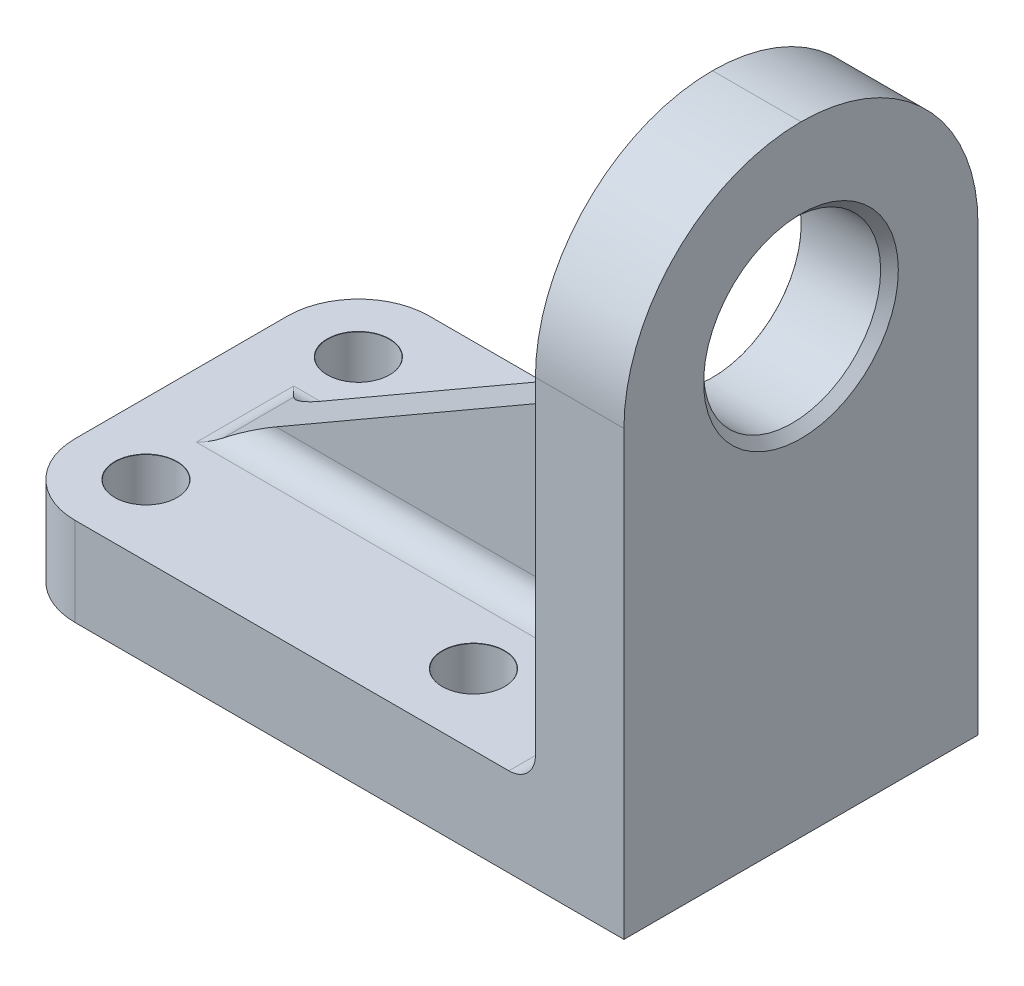
ISO-10303-21;
HEADER;
FILE_DESCRIPTION(('STEP AP214'),'2;1');
FILE_NAME('part.step','',(''),(''),'','','');
FILE_SCHEMA(('AUTOMOTIVE_DESIGN { 1 0 10303 214 1 1 1 1 }'));
ENDSEC;
DATA;
#1=APPLICATION_CONTEXT('core data for automotive mechanical design processes');
#2=APPLICATION_PROTOCOL_DEFINITION('international standard','automotive_design',2000,#1);
#3=PRODUCT_CONTEXT('',#1,'mechanical');
#4=PRODUCT('Part','Part','',(#3));
#5=PRODUCT_RELATED_PRODUCT_CATEGORY('part','',(#4));
#6=PRODUCT_DEFINITION_FORMATION('','',#4);
#7=PRODUCT_DEFINITION_CONTEXT('part definition',#1,'design');
#8=PRODUCT_DEFINITION('design','',#6,#7);
#9=PRODUCT_DEFINITION_SHAPE('','',#8);
#10=(LENGTH_UNIT() NAMED_UNIT(*) SI_UNIT(.MILLI.,.METRE.));
#11=(NAMED_UNIT(*) PLANE_ANGLE_UNIT() SI_UNIT($,.RADIAN.));
#12=(NAMED_UNIT(*) SI_UNIT($,.STERADIAN.) SOLID_ANGLE_UNIT());
#13=UNCERTAINTY_MEASURE_WITH_UNIT(LENGTH_MEASURE(1.E-05),#10,'distance_accuracy_value','');
#14=(GEOMETRIC_REPRESENTATION_CONTEXT(3) GLOBAL_UNCERTAINTY_ASSIGNED_CONTEXT((#13)) GLOBAL_UNIT_ASSIGNED_CONTEXT((#10,
#11,#12)) REPRESENTATION_CONTEXT('',''));
#15=CARTESIAN_POINT('',(0.,0.,0.));
#16=DIRECTION('',(0.,0.,1.));
#17=DIRECTION('',(1.,0.,0.));
#18=AXIS2_PLACEMENT_3D('',#15,#16,#17);
#19=CARTESIAN_POINT('',(0.,0.,-19.9999999999999));
#20=DIRECTION('',(0.,-1.,0.));
#21=DIRECTION('',(0.,0.,-1.));
#22=AXIS2_PLACEMENT_3D('',#19,#20,#21);
#23=PLANE('',#22);
#24=CARTESIAN_POINT('',(8.,0.,-11.9999999999999));
#25=DIRECTION('',(0.,1.,0.));
#26=DIRECTION('',(0.,0.,1.));
#27=AXIS2_PLACEMENT_3D('',#24,#25,#26);
#28=CIRCLE('',#27,3.5);
#29=CARTESIAN_POINT('',(8.,0.,-8.49999999999988));
#30=VERTEX_POINT('',#29);
#31=EDGE_CURVE('E554',#30,#30,#28,.T.);
#32=ORIENTED_EDGE('',*,*,#31,.T.);
#33=EDGE_LOOP('',(#32));
#34=FACE_BOUND('',#33,.T.);
#35=CARTESIAN_POINT('',(8.,0.,11.9999999999999));
#36=DIRECTION('',(0.,1.,0.));
#37=DIRECTION('',(0.,0.,1.));
#38=AXIS2_PLACEMENT_3D('',#35,#36,#37);
#39=CIRCLE('',#38,3.5);
#40=CARTESIAN_POINT('',(8.,0.,15.4999999999999));
#41=VERTEX_POINT('',#40);
#42=EDGE_CURVE('E565',#41,#41,#39,.T.);
#43=ORIENTED_EDGE('',*,*,#42,.T.);
#44=EDGE_LOOP('',(#43));
#45=FACE_BOUND('',#44,.T.);
#46=CARTESIAN_POINT('',(45.,0.,-11.9999999999999));
#47=DIRECTION('',(0.,1.,0.));
#48=DIRECTION('',(0.,0.,1.));
#49=AXIS2_PLACEMENT_3D('',#46,#47,#48);
#50=CIRCLE('',#49,3.5);
#51=CARTESIAN_POINT('',(45.,0.,-8.49999999999988));
#52=VERTEX_POINT('',#51);
#53=EDGE_CURVE('E577',#52,#52,#50,.T.);
#54=ORIENTED_EDGE('',*,*,#53,.T.);
#55=EDGE_LOOP('',(#54));
#56=FACE_BOUND('',#55,.T.);
#57=CARTESIAN_POINT('',(8.,0.,11.9999999999999));
#58=DIRECTION('',(0.,-1.,0.));
#59=DIRECTION('',(0.,0.,-1.));
#60=AXIS2_PLACEMENT_3D('',#57,#58,#59);
#61=CIRCLE('',#60,8.);
#62=CARTESIAN_POINT('',(8.,0.,19.9999999999999));
#63=VERTEX_POINT('',#62);
#64=CARTESIAN_POINT('',(0.,0.,11.9999999999999));
#65=VERTEX_POINT('',#64);
#66=EDGE_CURVE('E256',#63,#65,#61,.T.);
#67=ORIENTED_EDGE('',*,*,#66,.T.);
#68=DIRECTION('',(0.,0.,1.));
#69=VECTOR('',#68,1.);
#70=CARTESIAN_POINT('',(0.,0.,-19.9999999999999));
#71=LINE('',#70,#69);
#72=CARTESIAN_POINT('',(0.,0.,-11.9999999999999));
#73=VERTEX_POINT('',#72);
#74=EDGE_CURVE('E225',#73,#65,#71,.T.);
#75=ORIENTED_EDGE('',*,*,#74,.F.);
#76=CARTESIAN_POINT('',(8.,0.,-11.9999999999999));
#77=DIRECTION('',(0.,-1.,0.));
#78=DIRECTION('',(0.,0.,-1.));
#79=AXIS2_PLACEMENT_3D('',#76,#77,#78);
#80=CIRCLE('',#79,8.);
#81=CARTESIAN_POINT('',(8.,0.,-19.9999999999999));
#82=VERTEX_POINT('',#81);
#83=EDGE_CURVE('E253',#73,#82,#80,.T.);
#84=ORIENTED_EDGE('',*,*,#83,.T.);
#85=DIRECTION('',(1.,0.,0.));
#86=VECTOR('',#85,1.);
#87=CARTESIAN_POINT('',(0.,0.,-19.9999999999999));
#88=LINE('',#87,#86);
#89=CARTESIAN_POINT('',(70.,0.,-19.9999999999999));
#90=VERTEX_POINT('',#89);
#91=EDGE_CURVE('E210',#82,#90,#88,.T.);
#92=ORIENTED_EDGE('',*,*,#91,.T.);
#93=DIRECTION('',(0.,0.,1.));
#94=VECTOR('',#93,1.);
#95=CARTESIAN_POINT('',(70.,0.,-19.9999999999999));
#96=LINE('',#95,#94);
#97=CARTESIAN_POINT('',(70.,0.,19.9999999999999));
#98=VERTEX_POINT('',#97);
#99=EDGE_CURVE('E245',#90,#98,#96,.T.);
#100=ORIENTED_EDGE('',*,*,#99,.T.);
#101=DIRECTION('',(1.,0.,0.));
#102=VECTOR('',#101,1.);
#103=CARTESIAN_POINT('',(0.,0.,19.9999999999999));
#104=LINE('',#103,#102);
#105=EDGE_CURVE('E226',#63,#98,#104,.T.);
#106=ORIENTED_EDGE('',*,*,#105,.F.);
#107=EDGE_LOOP('',(#67,#75,#84,#92,#100,#106));
#108=FACE_BOUND('',#107,.T.);
#109=CARTESIAN_POINT('',(45.,0.,11.9999999999999));
#110=DIRECTION('',(0.,1.,0.));
#111=DIRECTION('',(0.,0.,1.));
#112=AXIS2_PLACEMENT_3D('',#109,#110,#111);
#113=CIRCLE('',#112,3.5);
#114=CARTESIAN_POINT('',(45.,0.,15.4999999999999));
#115=VERTEX_POINT('',#114);
#116=EDGE_CURVE('E364',#115,#115,#113,.T.);
#117=ORIENTED_EDGE('',*,*,#116,.T.);
#118=EDGE_LOOP('',(#117));
#119=FACE_BOUND('',#118,.T.);
#120=ADVANCED_FACE('F46',(#34,#45,#56,#108,#119),#23,.T.);
#121=CARTESIAN_POINT('',(57.,13.,-19.9999999999999));
#122=DIRECTION('',(0.,0.,-1.));
#123=DIRECTION('',(-1.,0.,0.));
#124=AXIS2_PLACEMENT_3D('',#121,#122,#123);
#125=CYLINDRICAL_SURFACE('',#124,3.);
#126=DIRECTION('',(0.,0.,1.));
#127=VECTOR('',#126,1.);
#128=CARTESIAN_POINT('',(57.,10.,-19.9999999999999));
#129=LINE('',#128,#127);
#130=CARTESIAN_POINT('',(57.,10.,-5.5));
#131=VERTEX_POINT('',#130);
#132=CARTESIAN_POINT('',(57.,10.,-19.9999999999999));
#133=VERTEX_POINT('',#132);
#134=EDGE_CURVE('E305',#131,#133,#129,.F.);
#135=ORIENTED_EDGE('',*,*,#134,.F.);
#136=CARTESIAN_POINT('',(57.,13.,-5.5));
#137=DIRECTION('',(0.,0.,-1.));
#138=DIRECTION('',(-1.,0.,0.));
#139=AXIS2_PLACEMENT_3D('',#136,#137,#138);
#140=CIRCLE('',#139,3.);
#141=CARTESIAN_POINT('',(60.,13.,-5.5));
#142=VERTEX_POINT('',#141);
#143=EDGE_CURVE('E333',#131,#142,#140,.F.);
#144=ORIENTED_EDGE('',*,*,#143,.T.);
#145=DIRECTION('',(0.,0.,1.));
#146=VECTOR('',#145,1.);
#147=CARTESIAN_POINT('',(60.,13.,19.9999999999999));
#148=LINE('',#147,#146);
#149=CARTESIAN_POINT('',(60.,13.,-19.9999999999999));
#150=VERTEX_POINT('',#149);
#151=EDGE_CURVE('E301',#150,#142,#148,.T.);
#152=ORIENTED_EDGE('',*,*,#151,.F.);
#153=CARTESIAN_POINT('',(57.,13.,-19.9999999999999));
#154=DIRECTION('',(0.,0.,-1.));
#155=DIRECTION('',(-1.,0.,0.));
#156=AXIS2_PLACEMENT_3D('',#153,#154,#155);
#157=CIRCLE('',#156,3.);
#158=EDGE_CURVE('E313',#133,#150,#157,.F.);
#159=ORIENTED_EDGE('',*,*,#158,.F.);
#160=EDGE_LOOP('',(#135,#144,#152,#159));
#161=FACE_BOUND('',#160,.T.);
#162=ADVANCED_FACE('F426',(#161),#125,.F.);
#163=CARTESIAN_POINT('',(0.,0.,-19.9999999999999));
#164=DIRECTION('',(-1.,0.,0.));
#165=DIRECTION('',(0.,0.,1.));
#166=AXIS2_PLACEMENT_3D('',#163,#164,#165);
#167=PLANE('',#166);
#168=ORIENTED_EDGE('',*,*,#74,.T.);
#169=DIRECTION('',(0.,-1.,0.));
#170=VECTOR('',#169,1.);
#171=CARTESIAN_POINT('',(0.,10.,11.9999999999999));
#172=LINE('',#171,#170);
#173=CARTESIAN_POINT('',(0.,10.,11.9999999999999));
#174=VERTEX_POINT('',#173);
#175=EDGE_CURVE('E264',#65,#174,#172,.F.);
#176=ORIENTED_EDGE('',*,*,#175,.T.);
#177=DIRECTION('',(0.,0.,1.));
#178=VECTOR('',#177,1.);
#179=CARTESIAN_POINT('',(0.,10.,-19.9999999999999));
#180=LINE('',#179,#178);
#181=CARTESIAN_POINT('',(0.,10.,-11.9999999999999));
#182=VERTEX_POINT('',#181);
#183=EDGE_CURVE('E240',#182,#174,#180,.T.);
#184=ORIENTED_EDGE('',*,*,#183,.F.);
#185=DIRECTION('',(0.,-1.,0.));
#186=VECTOR('',#185,1.);
#187=CARTESIAN_POINT('',(0.,0.,-11.9999999999999));
#188=LINE('',#187,#186);
#189=EDGE_CURVE('E260',#182,#73,#188,.T.);
#190=ORIENTED_EDGE('',*,*,#189,.T.);
#191=EDGE_LOOP('',(#168,#176,#184,#190));
#192=FACE_BOUND('',#191,.T.);
#193=ADVANCED_FACE('F460',(#192),#167,.T.);
#194=CARTESIAN_POINT('',(0.,10.,-19.9999999999999));
#195=DIRECTION('',(0.,1.,0.));
#196=DIRECTION('',(0.,0.,1.));
#197=AXIS2_PLACEMENT_3D('',#194,#195,#196);
#198=PLANE('',#197);
#199=CARTESIAN_POINT('',(8.,10.,-11.9999999999999));
#200=DIRECTION('',(0.,1.,0.));
#201=DIRECTION('',(0.,0.,1.));
#202=AXIS2_PLACEMENT_3D('',#199,#200,#201);
#203=CIRCLE('',#202,3.525);
#204=CARTESIAN_POINT('',(8.,10.,-8.47499999999988));
#205=VERTEX_POINT('',#204);
#206=EDGE_CURVE('E546',#205,#205,#203,.T.);
#207=ORIENTED_EDGE('',*,*,#206,.F.);
#208=EDGE_LOOP('',(#207));
#209=FACE_BOUND('',#208,.T.);
#210=CARTESIAN_POINT('',(8.,10.,11.9999999999999));
#211=DIRECTION('',(0.,1.,0.));
#212=DIRECTION('',(0.,0.,1.));
#213=AXIS2_PLACEMENT_3D('',#210,#211,#212);
#214=CIRCLE('',#213,3.525);
#215=CARTESIAN_POINT('',(8.,10.,15.5249999999999));
#216=VERTEX_POINT('',#215);
#217=EDGE_CURVE('E557',#216,#216,#214,.T.);
#218=ORIENTED_EDGE('',*,*,#217,.F.);
#219=EDGE_LOOP('',(#218));
#220=FACE_BOUND('',#219,.T.);
#221=CARTESIAN_POINT('',(45.,10.,-11.9999999999999));
#222=DIRECTION('',(0.,1.,0.));
#223=DIRECTION('',(0.,0.,1.));
#224=AXIS2_PLACEMENT_3D('',#221,#222,#223);
#225=CIRCLE('',#224,3.525);
#226=CARTESIAN_POINT('',(45.,10.,-8.47499999999988));
#227=VERTEX_POINT('',#226);
#228=EDGE_CURVE('E569',#227,#227,#225,.T.);
#229=ORIENTED_EDGE('',*,*,#228,.F.);
#230=EDGE_LOOP('',(#229));
#231=FACE_BOUND('',#230,.T.);
#232=CARTESIAN_POINT('',(45.,10.,11.9999999999999));
#233=DIRECTION('',(0.,1.,0.));
#234=DIRECTION('',(0.,0.,1.));
#235=AXIS2_PLACEMENT_3D('',#232,#233,#234);
#236=CIRCLE('',#235,3.525);
#237=CARTESIAN_POINT('',(45.,10.,15.5249999999999));
#238=VERTEX_POINT('',#237);
#239=EDGE_CURVE('E581',#238,#238,#236,.T.);
#240=ORIENTED_EDGE('',*,*,#239,.F.);
#241=EDGE_LOOP('',(#240));
#242=FACE_BOUND('',#241,.T.);
#243=DIRECTION('',(0.,0.,-1.));
#244=VECTOR('',#243,1.);
#245=CARTESIAN_POINT('',(7.19615242270664,10.,-2.5));
#246=LINE('',#245,#244);
#247=CARTESIAN_POINT('',(7.19615242270664,10.,5.5));
#248=VERTEX_POINT('',#247);
#249=CARTESIAN_POINT('',(7.19615242270664,10.,-5.5));
#250=VERTEX_POINT('',#249);
#251=EDGE_CURVE('E319',#248,#250,#246,.T.);
#252=ORIENTED_EDGE('',*,*,#251,.T.);
#253=DIRECTION('',(1.,0.,0.));
#254=VECTOR('',#253,1.);
#255=CARTESIAN_POINT('',(0.,10.,-5.5));
#256=LINE('',#255,#254);
#257=EDGE_CURVE('E322',#250,#131,#256,.T.);
#258=ORIENTED_EDGE('',*,*,#257,.T.);
#259=ORIENTED_EDGE('',*,*,#134,.T.);
#260=DIRECTION('',(-1.,0.,0.));
#261=VECTOR('',#260,1.);
#262=CARTESIAN_POINT('',(0.,10.,-19.9999999999999));
#263=LINE('',#262,#261);
#264=CARTESIAN_POINT('',(8.,10.,-19.9999999999999));
#265=VERTEX_POINT('',#264);
#266=EDGE_CURVE('E222',#133,#265,#263,.T.);
#267=ORIENTED_EDGE('',*,*,#266,.T.);
#268=CARTESIAN_POINT('',(8.,10.,-11.9999999999999));
#269=DIRECTION('',(0.,1.,0.));
#270=DIRECTION('',(0.,0.,1.));
#271=AXIS2_PLACEMENT_3D('',#268,#269,#270);
#272=CIRCLE('',#271,8.);
#273=EDGE_CURVE('E267',#265,#182,#272,.T.);
#274=ORIENTED_EDGE('',*,*,#273,.T.);
#275=ORIENTED_EDGE('',*,*,#183,.T.);
#276=CARTESIAN_POINT('',(8.,10.,11.9999999999999));
#277=DIRECTION('',(0.,1.,0.));
#278=DIRECTION('',(0.,0.,1.));
#279=AXIS2_PLACEMENT_3D('',#276,#277,#278);
#280=CIRCLE('',#279,8.);
#281=CARTESIAN_POINT('',(8.,10.,19.9999999999999));
#282=VERTEX_POINT('',#281);
#283=EDGE_CURVE('E270',#174,#282,#280,.T.);
#284=ORIENTED_EDGE('',*,*,#283,.T.);
#285=DIRECTION('',(-1.,0.,0.));
#286=VECTOR('',#285,1.);
#287=CARTESIAN_POINT('',(0.,10.,19.9999999999999));
#288=LINE('',#287,#286);
#289=CARTESIAN_POINT('',(57.,10.,19.9999999999999));
#290=VERTEX_POINT('',#289);
#291=EDGE_CURVE('E214',#290,#282,#288,.T.);
#292=ORIENTED_EDGE('',*,*,#291,.F.);
#293=CARTESIAN_POINT('',(57.,10.,5.5));
#294=VERTEX_POINT('',#293);
#295=EDGE_CURVE('E306',#290,#294,#129,.F.);
#296=ORIENTED_EDGE('',*,*,#295,.T.);
#297=DIRECTION('',(1.,0.,0.));
#298=VECTOR('',#297,1.);
#299=CARTESIAN_POINT('',(8.,10.,5.5));
#300=LINE('',#299,#298);
#301=EDGE_CURVE('E316',#294,#248,#300,.F.);
#302=ORIENTED_EDGE('',*,*,#301,.T.);
#303=EDGE_LOOP('',(#252,#258,#259,#267,#274,#275,#284,#292,#296,#302));
#304=FACE_BOUND('',#303,.T.);
#305=ADVANCED_FACE('F403',(#209,#220,#231,#242,#304),#198,.T.);
#306=CARTESIAN_POINT('',(60.,70.,-19.9999999999999));
#307=DIRECTION('',(-1.,0.,0.));
#308=DIRECTION('',(0.,-1.,0.));
#309=AXIS2_PLACEMENT_3D('',#306,#307,#308);
#310=PLANE('',#309);
#311=CARTESIAN_POINT('',(60.,50.,-1.21430643318376E-13));
#312=DIRECTION('',(1.,0.,0.));
#313=DIRECTION('',(0.,0.,-1.));
#314=AXIS2_PLACEMENT_3D('',#311,#312,#313);
#315=CIRCLE('',#314,10.025);
#316=CARTESIAN_POINT('',(60.,50.,-10.0250000000001));
#317=VERTEX_POINT('',#316);
#318=EDGE_CURVE('E529',#317,#317,#315,.T.);
#319=ORIENTED_EDGE('',*,*,#318,.T.);
#320=EDGE_LOOP('',(#319));
#321=FACE_BOUND('',#320,.T.);
#322=DIRECTION('',(0.,0.,1.));
#323=VECTOR('',#322,1.);
#324=CARTESIAN_POINT('',(60.,38.,2.5));
#325=LINE('',#324,#323);
#326=CARTESIAN_POINT('',(60.,38.,-5.5));
#327=VERTEX_POINT('',#326);
#328=CARTESIAN_POINT('',(60.,38.,5.5));
#329=VERTEX_POINT('',#328);
#330=EDGE_CURVE('E341',#327,#329,#325,.T.);
#331=ORIENTED_EDGE('',*,*,#330,.T.);
#332=DIRECTION('',(0.,1.,0.));
#333=VECTOR('',#332,1.);
#334=CARTESIAN_POINT('',(60.,13.,5.5));
#335=LINE('',#334,#333);
#336=CARTESIAN_POINT('',(60.,13.,5.5));
#337=VERTEX_POINT('',#336);
#338=EDGE_CURVE('E347',#329,#337,#335,.F.);
#339=ORIENTED_EDGE('',*,*,#338,.T.);
#340=CARTESIAN_POINT('',(60.,13.,19.9999999999999));
#341=VERTEX_POINT('',#340);
#342=EDGE_CURVE('E297',#337,#341,#148,.T.);
#343=ORIENTED_EDGE('',*,*,#342,.T.);
#344=DIRECTION('',(0.,-1.,0.));
#345=VECTOR('',#344,1.);
#346=CARTESIAN_POINT('',(60.,70.,19.9999999999999));
#347=LINE('',#346,#345);
#348=CARTESIAN_POINT('',(60.,50.,19.9999999999999));
#349=VERTEX_POINT('',#348);
#350=EDGE_CURVE('E234',#349,#341,#347,.T.);
#351=ORIENTED_EDGE('',*,*,#350,.F.);
#352=CARTESIAN_POINT('',(60.,50.,-1.21430643318376E-13));
#353=DIRECTION('',(-1.,0.,0.));
#354=DIRECTION('',(0.,-1.,0.));
#355=AXIS2_PLACEMENT_3D('',#352,#353,#354);
#356=CIRCLE('',#355,20.);
#357=CARTESIAN_POINT('',(60.,70.,1.21430643318376E-13));
#358=VERTEX_POINT('',#357);
#359=EDGE_CURVE('E285',#349,#358,#356,.T.);
#360=ORIENTED_EDGE('',*,*,#359,.T.);
#361=CARTESIAN_POINT('',(60.,50.,1.21430643318376E-13));
#362=DIRECTION('',(-1.,0.,0.));
#363=DIRECTION('',(0.,-1.,0.));
#364=AXIS2_PLACEMENT_3D('',#361,#362,#363);
#365=CIRCLE('',#364,20.);
#366=CARTESIAN_POINT('',(60.,50.,-19.9999999999999));
#367=VERTEX_POINT('',#366);
#368=EDGE_CURVE('E282',#358,#367,#365,.T.);
#369=ORIENTED_EDGE('',*,*,#368,.T.);
#370=DIRECTION('',(0.,-1.,0.));
#371=VECTOR('',#370,1.);
#372=CARTESIAN_POINT('',(60.,70.,-19.9999999999999));
#373=LINE('',#372,#371);
#374=EDGE_CURVE('E218',#367,#150,#373,.T.);
#375=ORIENTED_EDGE('',*,*,#374,.T.);
#376=ORIENTED_EDGE('',*,*,#151,.T.);
#377=DIRECTION('',(0.,1.,0.));
#378=VECTOR('',#377,1.);
#379=CARTESIAN_POINT('',(60.,70.,-5.5));
#380=LINE('',#379,#378);
#381=EDGE_CURVE('E344',#142,#327,#380,.T.);
#382=ORIENTED_EDGE('',*,*,#381,.T.);
#383=EDGE_LOOP('',(#331,#339,#343,#351,#360,#369,#375,#376,#382));
#384=FACE_BOUND('',#383,.T.);
#385=ADVANCED_FACE('F429',(#321,#384),#310,.T.);
#386=CARTESIAN_POINT('',(70.,0.,-19.9999999999999));
#387=DIRECTION('',(1.,0.,0.));
#388=DIRECTION('',(0.,0.,-1.));
#389=AXIS2_PLACEMENT_3D('',#386,#387,#388);
#390=PLANE('',#389);
#391=CARTESIAN_POINT('',(70.,50.,-1.21430643318376E-13));
#392=DIRECTION('',(1.,0.,0.));
#393=DIRECTION('',(0.,0.,-1.));
#394=AXIS2_PLACEMENT_3D('',#391,#392,#393);
#395=CIRCLE('',#394,11.);
#396=CARTESIAN_POINT('',(70.,50.,-11.0000000000001));
#397=VERTEX_POINT('',#396);
#398=EDGE_CURVE('E532',#397,#397,#395,.T.);
#399=ORIENTED_EDGE('',*,*,#398,.F.);
#400=EDGE_LOOP('',(#399));
#401=FACE_BOUND('',#400,.T.);
#402=DIRECTION('',(0.,1.,0.));
#403=VECTOR('',#402,1.);
#404=CARTESIAN_POINT('',(70.,0.,19.9999999999999));
#405=LINE('',#404,#403);
#406=CARTESIAN_POINT('',(70.,50.,19.9999999999999));
#407=VERTEX_POINT('',#406);
#408=EDGE_CURVE('E230',#98,#407,#405,.T.);
#409=ORIENTED_EDGE('',*,*,#408,.F.);
#410=ORIENTED_EDGE('',*,*,#99,.F.);
#411=DIRECTION('',(0.,1.,0.));
#412=VECTOR('',#411,1.);
#413=CARTESIAN_POINT('',(70.,0.,-19.9999999999999));
#414=LINE('',#413,#412);
#415=CARTESIAN_POINT('',(70.,50.,-19.9999999999999));
#416=VERTEX_POINT('',#415);
#417=EDGE_CURVE('E213',#90,#416,#414,.T.);
#418=ORIENTED_EDGE('',*,*,#417,.T.);
#419=CARTESIAN_POINT('',(70.,50.,1.21430643318376E-13));
#420=DIRECTION('',(1.,0.,0.));
#421=DIRECTION('',(0.,0.,-1.));
#422=AXIS2_PLACEMENT_3D('',#419,#420,#421);
#423=CIRCLE('',#422,20.);
#424=CARTESIAN_POINT('',(70.,70.,1.21430643318376E-13));
#425=VERTEX_POINT('',#424);
#426=EDGE_CURVE('E288',#416,#425,#423,.T.);
#427=ORIENTED_EDGE('',*,*,#426,.T.);
#428=CARTESIAN_POINT('',(70.,50.,-1.21430643318376E-13));
#429=DIRECTION('',(1.,0.,0.));
#430=DIRECTION('',(0.,0.,-1.));
#431=AXIS2_PLACEMENT_3D('',#428,#429,#430);
#432=CIRCLE('',#431,20.);
#433=EDGE_CURVE('E291',#425,#407,#432,.T.);
#434=ORIENTED_EDGE('',*,*,#433,.T.);
#435=EDGE_LOOP('',(#409,#410,#418,#427,#434));
#436=FACE_BOUND('',#435,.T.);
#437=ADVANCED_FACE('F466',(#401,#436),#390,.T.);
#438=CARTESIAN_POINT('',(0.,0.,-19.9999999999999));
#439=DIRECTION('',(0.,0.,-1.));
#440=DIRECTION('',(-1.,0.,0.));
#441=AXIS2_PLACEMENT_3D('',#438,#439,#440);
#442=PLANE('',#441);
#443=ORIENTED_EDGE('',*,*,#374,.F.);
#444=DIRECTION('',(-1.,0.,0.));
#445=VECTOR('',#444,1.);
#446=CARTESIAN_POINT('',(0.,50.,-19.9999999999999));
#447=LINE('',#446,#445);
#448=EDGE_CURVE('E294',#367,#416,#447,.F.);
#449=ORIENTED_EDGE('',*,*,#448,.T.);
#450=ORIENTED_EDGE('',*,*,#417,.F.);
#451=ORIENTED_EDGE('',*,*,#91,.F.);
#452=DIRECTION('',(0.,-1.,0.));
#453=VECTOR('',#452,1.);
#454=CARTESIAN_POINT('',(8.,0.,-19.9999999999999));
#455=LINE('',#454,#453);
#456=EDGE_CURVE('E274',#82,#265,#455,.F.);
#457=ORIENTED_EDGE('',*,*,#456,.T.);
#458=ORIENTED_EDGE('',*,*,#266,.F.);
#459=ORIENTED_EDGE('',*,*,#158,.T.);
#460=EDGE_LOOP('',(#443,#449,#450,#451,#457,#458,#459));
#461=FACE_BOUND('',#460,.T.);
#462=ADVANCED_FACE('F421',(#461),#442,.T.);
#463=CARTESIAN_POINT('',(0.,0.,19.9999999999999));
#464=DIRECTION('',(0.,0.,-1.));
#465=DIRECTION('',(-1.,0.,0.));
#466=AXIS2_PLACEMENT_3D('',#463,#464,#465);
#467=PLANE('',#466);
#468=ORIENTED_EDGE('',*,*,#408,.T.);
#469=DIRECTION('',(-1.,0.,0.));
#470=VECTOR('',#469,1.);
#471=CARTESIAN_POINT('',(60.,50.,19.9999999999999));
#472=LINE('',#471,#470);
#473=EDGE_CURVE('E278',#407,#349,#472,.T.);
#474=ORIENTED_EDGE('',*,*,#473,.T.);
#475=ORIENTED_EDGE('',*,*,#350,.T.);
#476=CARTESIAN_POINT('',(57.,13.,19.9999999999999));
#477=DIRECTION('',(0.,0.,-1.));
#478=DIRECTION('',(-1.,0.,0.));
#479=AXIS2_PLACEMENT_3D('',#476,#477,#478);
#480=CIRCLE('',#479,3.);
#481=EDGE_CURVE('E310',#341,#290,#480,.T.);
#482=ORIENTED_EDGE('',*,*,#481,.T.);
#483=ORIENTED_EDGE('',*,*,#291,.T.);
#484=DIRECTION('',(0.,-1.,0.));
#485=VECTOR('',#484,1.);
#486=CARTESIAN_POINT('',(8.,0.,19.9999999999999));
#487=LINE('',#486,#485);
#488=EDGE_CURVE('E244',#282,#63,#487,.T.);
#489=ORIENTED_EDGE('',*,*,#488,.T.);
#490=ORIENTED_EDGE('',*,*,#105,.T.);
#491=EDGE_LOOP('',(#468,#474,#475,#482,#483,#489,#490));
#492=FACE_BOUND('',#491,.T.);
#493=ADVANCED_FACE('F475',(#492),#467,.F.);
#494=CARTESIAN_POINT('',(8.,0.,11.9999999999999));
#495=DIRECTION('',(0.,1.,0.));
#496=DIRECTION('',(0.,0.,1.));
#497=AXIS2_PLACEMENT_3D('',#494,#495,#496);
#498=CYLINDRICAL_SURFACE('',#497,8.);
#499=ORIENTED_EDGE('',*,*,#283,.F.);
#500=ORIENTED_EDGE('',*,*,#175,.F.);
#501=ORIENTED_EDGE('',*,*,#66,.F.);
#502=ORIENTED_EDGE('',*,*,#488,.F.);
#503=EDGE_LOOP('',(#499,#500,#501,#502));
#504=FACE_BOUND('',#503,.T.);
#505=ADVANCED_FACE('F471',(#504),#498,.T.);
#506=CARTESIAN_POINT('',(8.,0.,-11.9999999999999));
#507=DIRECTION('',(0.,-1.,0.));
#508=DIRECTION('',(0.,0.,-1.));
#509=AXIS2_PLACEMENT_3D('',#506,#507,#508);
#510=CYLINDRICAL_SURFACE('',#509,8.);
#511=ORIENTED_EDGE('',*,*,#273,.F.);
#512=ORIENTED_EDGE('',*,*,#456,.F.);
#513=ORIENTED_EDGE('',*,*,#83,.F.);
#514=ORIENTED_EDGE('',*,*,#189,.F.);
#515=EDGE_LOOP('',(#511,#512,#513,#514));
#516=FACE_BOUND('',#515,.T.);
#517=ADVANCED_FACE('F474',(#516),#510,.T.);
#518=CARTESIAN_POINT('',(70.,50.,1.21430643318376E-13));
#519=DIRECTION('',(-1.,0.,0.));
#520=DIRECTION('',(0.,0.,1.));
#521=AXIS2_PLACEMENT_3D('',#518,#519,#520);
#522=CYLINDRICAL_SURFACE('',#521,20.);
#523=DIRECTION('',(-1.,0.,0.));
#524=VECTOR('',#523,1.);
#525=CARTESIAN_POINT('',(70.,70.,1.21430643318376E-13));
#526=LINE('',#525,#524);
#527=EDGE_CURVE('E196',#425,#358,#526,.T.);
#528=ORIENTED_EDGE('',*,*,#527,.F.);
#529=ORIENTED_EDGE('',*,*,#426,.F.);
#530=ORIENTED_EDGE('',*,*,#448,.F.);
#531=ORIENTED_EDGE('',*,*,#368,.F.);
#532=EDGE_LOOP('',(#528,#529,#530,#531));
#533=FACE_BOUND('',#532,.T.);
#534=ADVANCED_FACE('F479',(#533),#522,.T.);
#535=CARTESIAN_POINT('',(0.,50.,-1.21430643318376E-13));
#536=DIRECTION('',(1.,0.,0.));
#537=DIRECTION('',(0.,0.,-1.));
#538=AXIS2_PLACEMENT_3D('',#535,#536,#537);
#539=CYLINDRICAL_SURFACE('',#538,20.);
#540=ORIENTED_EDGE('',*,*,#433,.F.);
#541=ORIENTED_EDGE('',*,*,#527,.T.);
#542=ORIENTED_EDGE('',*,*,#359,.F.);
#543=ORIENTED_EDGE('',*,*,#473,.F.);
#544=EDGE_LOOP('',(#540,#541,#542,#543));
#545=FACE_BOUND('',#544,.T.);
#546=ADVANCED_FACE('F481',(#545),#539,.T.);
#547=ORIENTED_EDGE('',*,*,#342,.F.);
#548=CARTESIAN_POINT('',(57.,13.,5.5));
#549=DIRECTION('',(0.,0.,-1.));
#550=DIRECTION('',(-1.,0.,0.));
#551=AXIS2_PLACEMENT_3D('',#548,#549,#550);
#552=CIRCLE('',#551,3.);
#553=EDGE_CURVE('E350',#337,#294,#552,.T.);
#554=ORIENTED_EDGE('',*,*,#553,.T.);
#555=ORIENTED_EDGE('',*,*,#295,.F.);
#556=ORIENTED_EDGE('',*,*,#481,.F.);
#557=EDGE_LOOP('',(#547,#554,#555,#556));
#558=FACE_BOUND('',#557,.T.);
#559=ADVANCED_FACE('F409',(#558),#125,.F.);
#560=CARTESIAN_POINT('',(51.3012701892225,35.,0.));
#561=DIRECTION('',(0.,-1.,0.));
#562=DIRECTION('',(1.,0.,0.));
#563=AXIS2_PLACEMENT_3D('',#560,#561,#562);
#564=PLANE('',#563);
#565=DIRECTION('',(1.,0.,0.));
#566=VECTOR('',#565,1.);
#567=CARTESIAN_POINT('',(35.,35.,2.5));
#568=LINE('',#567,#566);
#569=CARTESIAN_POINT('',(51.3012701892225,35.,2.5));
#570=VERTEX_POINT('',#569);
#571=CARTESIAN_POINT('',(57.,35.,2.5));
#572=VERTEX_POINT('',#571);
#573=EDGE_CURVE('E187',#570,#572,#568,.T.);
#574=ORIENTED_EDGE('',*,*,#573,.T.);
#575=DIRECTION('',(0.,0.,-1.));
#576=VECTOR('',#575,1.);
#577=CARTESIAN_POINT('',(57.,35.,-2.5));
#578=LINE('',#577,#576);
#579=CARTESIAN_POINT('',(57.,35.,-2.5));
#580=VERTEX_POINT('',#579);
#581=EDGE_CURVE('E355',#572,#580,#578,.T.);
#582=ORIENTED_EDGE('',*,*,#581,.T.);
#583=DIRECTION('',(1.,0.,0.));
#584=VECTOR('',#583,1.);
#585=CARTESIAN_POINT('',(35.,35.,-2.5));
#586=LINE('',#585,#584);
#587=CARTESIAN_POINT('',(51.3012701892225,35.,-2.5));
#588=VERTEX_POINT('',#587);
#589=EDGE_CURVE('E194',#588,#580,#586,.T.);
#590=ORIENTED_EDGE('',*,*,#589,.F.);
#591=DIRECTION('',(0.,0.,1.));
#592=VECTOR('',#591,1.);
#593=CARTESIAN_POINT('',(51.3012701892225,35.,0.));
#594=LINE('',#593,#592);
#595=EDGE_CURVE('E181',#588,#570,#594,.T.);
#596=ORIENTED_EDGE('',*,*,#595,.T.);
#597=EDGE_LOOP('',(#574,#582,#590,#596));
#598=FACE_BOUND('',#597,.T.);
#599=ADVANCED_FACE('F191',(#598),#564,.F.);
#600=CARTESIAN_POINT('',(8.,10.,0.));
#601=DIRECTION('',(0.499999999999995,-0.866025403784442,0.));
#602=DIRECTION('',(0.866025403784442,0.499999999999995,0.));
#603=AXIS2_PLACEMENT_3D('',#600,#601,#602);
#604=PLANE('',#603);
#605=CARTESIAN_POINT('',(13.1961524227067,13.,-5.5));
#606=DIRECTION('',(0.499999999999995,-0.866025403784442,0.));
#607=DIRECTION('',(0.866025403784442,0.499999999999995,0.));
#608=AXIS2_PLACEMENT_3D('',#605,#606,#607);
#609=ELLIPSE('',#608,6.00000000000006,3.);
#610=CARTESIAN_POINT('',(13.1961524227067,13.,-2.5));
#611=VERTEX_POINT('',#610);
#612=CARTESIAN_POINT('',(8.69615242270663,10.4019237886467,-4.00000000000002));
#613=VERTEX_POINT('',#612);
#614=EDGE_CURVE('E56',#611,#613,#609,.T.);
#615=ORIENTED_EDGE('',*,*,#614,.T.);
#616=DIRECTION('',(0.,0.,1.));
#617=VECTOR('',#616,1.);
#618=CARTESIAN_POINT('',(8.69615242270663,10.4019237886467,2.5));
#619=LINE('',#618,#617);
#620=CARTESIAN_POINT('',(8.69615242270663,10.4019237886467,4.00000000000002));
#621=VERTEX_POINT('',#620);
#622=EDGE_CURVE('E63',#613,#621,#619,.T.);
#623=ORIENTED_EDGE('',*,*,#622,.T.);
#624=CARTESIAN_POINT('',(13.1961524227067,13.,5.5));
#625=DIRECTION('',(0.499999999999995,-0.866025403784442,0.));
#626=DIRECTION('',(-0.866025403784442,-0.499999999999995,0.));
#627=AXIS2_PLACEMENT_3D('',#624,#625,#626);
#628=ELLIPSE('',#627,6.00000000000006,3.);
#629=CARTESIAN_POINT('',(13.1961524227067,13.,2.5));
#630=VERTEX_POINT('',#629);
#631=EDGE_CURVE('E11',#621,#630,#628,.T.);
#632=ORIENTED_EDGE('',*,*,#631,.T.);
#633=DIRECTION('',(0.866025403784442,0.499999999999995,0.));
#634=VECTOR('',#633,1.);
#635=CARTESIAN_POINT('',(8.,10.,2.5));
#636=LINE('',#635,#634);
#637=EDGE_CURVE('E177',#630,#570,#636,.T.);
#638=ORIENTED_EDGE('',*,*,#637,.T.);
#639=ORIENTED_EDGE('',*,*,#595,.F.);
#640=DIRECTION('',(0.866025403784442,0.499999999999995,0.));
#641=VECTOR('',#640,1.);
#642=CARTESIAN_POINT('',(8.,10.,-2.5));
#643=LINE('',#642,#641);
#644=EDGE_CURVE('E202',#611,#588,#643,.T.);
#645=ORIENTED_EDGE('',*,*,#644,.F.);
#646=EDGE_LOOP('',(#615,#623,#632,#638,#639,#645));
#647=FACE_BOUND('',#646,.T.);
#648=ADVANCED_FACE('F179',(#647),#604,.F.);
#649=CARTESIAN_POINT('',(35.,35.,2.5));
#650=DIRECTION('',(0.,0.,1.));
#651=DIRECTION('',(1.,0.,0.));
#652=AXIS2_PLACEMENT_3D('',#649,#650,#651);
#653=PLANE('',#652);
#654=DIRECTION('',(1.,0.,0.));
#655=VECTOR('',#654,1.);
#656=CARTESIAN_POINT('',(57.,13.,2.5));
#657=LINE('',#656,#655);
#658=CARTESIAN_POINT('',(57.,13.,2.5));
#659=VERTEX_POINT('',#658);
#660=EDGE_CURVE('E336',#630,#659,#657,.T.);
#661=ORIENTED_EDGE('',*,*,#660,.T.);
#662=DIRECTION('',(0.,1.,0.));
#663=VECTOR('',#662,1.);
#664=CARTESIAN_POINT('',(57.,35.,2.5));
#665=LINE('',#664,#663);
#666=EDGE_CURVE('E200',#659,#572,#665,.T.);
#667=ORIENTED_EDGE('',*,*,#666,.T.);
#668=ORIENTED_EDGE('',*,*,#573,.F.);
#669=ORIENTED_EDGE('',*,*,#637,.F.);
#670=EDGE_LOOP('',(#661,#667,#668,#669));
#671=FACE_BOUND('',#670,.T.);
#672=ADVANCED_FACE('F198',(#671),#653,.T.);
#673=CARTESIAN_POINT('',(35.,35.,-2.5));
#674=DIRECTION('',(0.,0.,1.));
#675=DIRECTION('',(1.,0.,0.));
#676=AXIS2_PLACEMENT_3D('',#673,#674,#675);
#677=PLANE('',#676);
#678=DIRECTION('',(0.,1.,0.));
#679=VECTOR('',#678,1.);
#680=CARTESIAN_POINT('',(57.,35.,-2.5));
#681=LINE('',#680,#679);
#682=CARTESIAN_POINT('',(57.,13.,-2.5));
#683=VERTEX_POINT('',#682);
#684=EDGE_CURVE('E326',#580,#683,#681,.F.);
#685=ORIENTED_EDGE('',*,*,#684,.T.);
#686=DIRECTION('',(1.,0.,0.));
#687=VECTOR('',#686,1.);
#688=CARTESIAN_POINT('',(35.,13.,-2.5));
#689=LINE('',#688,#687);
#690=EDGE_CURVE('E329',#683,#611,#689,.F.);
#691=ORIENTED_EDGE('',*,*,#690,.T.);
#692=ORIENTED_EDGE('',*,*,#644,.T.);
#693=ORIENTED_EDGE('',*,*,#589,.T.);
#694=EDGE_LOOP('',(#685,#691,#692,#693));
#695=FACE_BOUND('',#694,.T.);
#696=ADVANCED_FACE('F442',(#695),#677,.F.);
#697=CARTESIAN_POINT('',(57.,35.,5.5));
#698=DIRECTION('',(0.,-1.,0.));
#699=DIRECTION('',(1.,0.,0.));
#700=AXIS2_PLACEMENT_3D('',#697,#698,#699);
#701=CYLINDRICAL_SURFACE('',#700,3.);
#702=CARTESIAN_POINT('',(57.,13.,5.5));
#703=DIRECTION('',(0.,1.,0.));
#704=DIRECTION('',(0.,0.,1.));
#705=AXIS2_PLACEMENT_3D('',#702,#703,#704);
#706=CIRCLE('',#705,3.);
#707=EDGE_CURVE('E50',#337,#659,#706,.T.);
#708=ORIENTED_EDGE('',*,*,#707,.F.);
#709=ORIENTED_EDGE('',*,*,#338,.F.);
#710=CARTESIAN_POINT('',(57.,38.,5.5));
#711=DIRECTION('',(0.,0.707106781186547,-0.707106781186547));
#712=DIRECTION('',(0.,-0.707106781186547,-0.707106781186547));
#713=AXIS2_PLACEMENT_3D('',#710,#711,#712);
#714=ELLIPSE('',#713,4.24264068711928,3.);
#715=EDGE_CURVE('E382',#572,#329,#714,.F.);
#716=ORIENTED_EDGE('',*,*,#715,.F.);
#717=ORIENTED_EDGE('',*,*,#666,.F.);
#718=EDGE_LOOP('',(#708,#709,#716,#717));
#719=FACE_BOUND('',#718,.T.);
#720=ADVANCED_FACE('F48',(#719),#701,.F.);
#721=CARTESIAN_POINT('',(57.,13.,5.5));
#722=DIRECTION('',(0.,0.,1.));
#723=DIRECTION('',(1.,0.,0.));
#724=AXIS2_PLACEMENT_3D('',#721,#722,#723);
#725=SPHERICAL_SURFACE('',#724,3.);
#726=ORIENTED_EDGE('',*,*,#553,.F.);
#727=ORIENTED_EDGE('',*,*,#707,.T.);
#728=CARTESIAN_POINT('',(57.,13.,5.5));
#729=DIRECTION('',(1.,0.,0.));
#730=DIRECTION('',(0.,0.,-1.));
#731=AXIS2_PLACEMENT_3D('',#728,#729,#730);
#732=CIRCLE('',#731,3.);
#733=EDGE_CURVE('E379',#294,#659,#732,.T.);
#734=ORIENTED_EDGE('',*,*,#733,.F.);
#735=EDGE_LOOP('',(#726,#727,#734));
#736=FACE_BOUND('',#735,.T.);
#737=ADVANCED_FACE('F394',(#736),#725,.F.);
#738=CARTESIAN_POINT('',(57.,38.,0.));
#739=DIRECTION('',(0.,0.,-1.));
#740=DIRECTION('',(-1.,0.,0.));
#741=AXIS2_PLACEMENT_3D('',#738,#739,#740);
#742=CYLINDRICAL_SURFACE('',#741,3.);
#743=ORIENTED_EDGE('',*,*,#715,.T.);
#744=ORIENTED_EDGE('',*,*,#330,.F.);
#745=CARTESIAN_POINT('',(57.,38.,-5.5));
#746=DIRECTION('',(0.,-0.707106781186547,-0.707106781186547));
#747=DIRECTION('',(0.,0.707106781186547,-0.707106781186547));
#748=AXIS2_PLACEMENT_3D('',#745,#746,#747);
#749=ELLIPSE('',#748,4.24264068711928,3.);
#750=EDGE_CURVE('E375',#580,#327,#749,.F.);
#751=ORIENTED_EDGE('',*,*,#750,.F.);
#752=ORIENTED_EDGE('',*,*,#581,.F.);
#753=EDGE_LOOP('',(#743,#744,#751,#752));
#754=FACE_BOUND('',#753,.T.);
#755=ADVANCED_FACE('F768',(#754),#742,.F.);
#756=CARTESIAN_POINT('',(35.,13.,5.5));
#757=DIRECTION('',(-1.,0.,0.));
#758=DIRECTION('',(0.,0.,1.));
#759=AXIS2_PLACEMENT_3D('',#756,#757,#758);
#760=CYLINDRICAL_SURFACE('',#759,3.);
#761=ORIENTED_EDGE('',*,*,#660,.F.);
#762=ORIENTED_EDGE('',*,*,#631,.F.);
#763=CARTESIAN_POINT('',(7.19615242270664,13.,5.5));
#764=DIRECTION('',(-0.707106781186547,0.,-0.707106781186547));
#765=DIRECTION('',(-0.707106781186547,0.,0.707106781186547));
#766=AXIS2_PLACEMENT_3D('',#763,#764,#765);
#767=ELLIPSE('',#766,4.24264068711928,3.);
#768=EDGE_CURVE('E372',#248,#621,#767,.F.);
#769=ORIENTED_EDGE('',*,*,#768,.F.);
#770=ORIENTED_EDGE('',*,*,#301,.F.);
#771=ORIENTED_EDGE('',*,*,#733,.T.);
#772=EDGE_LOOP('',(#761,#762,#769,#770,#771));
#773=FACE_BOUND('',#772,.T.);
#774=ADVANCED_FACE('F399',(#773),#760,.F.);
#775=CARTESIAN_POINT('',(57.,70.,-5.5));
#776=DIRECTION('',(0.,1.,0.));
#777=DIRECTION('',(-1.,0.,0.));
#778=AXIS2_PLACEMENT_3D('',#775,#776,#777);
#779=CYLINDRICAL_SURFACE('',#778,3.);
#780=ORIENTED_EDGE('',*,*,#750,.T.);
#781=ORIENTED_EDGE('',*,*,#381,.F.);
#782=CARTESIAN_POINT('',(57.,13.,-5.5));
#783=DIRECTION('',(0.,1.,0.));
#784=DIRECTION('',(0.,0.,1.));
#785=AXIS2_PLACEMENT_3D('',#782,#783,#784);
#786=CIRCLE('',#785,3.);
#787=EDGE_CURVE('E368',#683,#142,#786,.T.);
#788=ORIENTED_EDGE('',*,*,#787,.F.);
#789=ORIENTED_EDGE('',*,*,#684,.F.);
#790=EDGE_LOOP('',(#780,#781,#788,#789));
#791=FACE_BOUND('',#790,.T.);
#792=ADVANCED_FACE('F432',(#791),#779,.F.);
#793=CARTESIAN_POINT('',(7.19615242270664,13.,0.));
#794=DIRECTION('',(0.,0.,1.));
#795=DIRECTION('',(1.,0.,0.));
#796=AXIS2_PLACEMENT_3D('',#793,#794,#795);
#797=CYLINDRICAL_SURFACE('',#796,3.);
#798=ORIENTED_EDGE('',*,*,#622,.F.);
#799=CARTESIAN_POINT('',(7.19615242270664,13.,-5.5));
#800=DIRECTION('',(-0.707106781186547,0.,0.707106781186547));
#801=DIRECTION('',(0.707106781186547,0.,0.707106781186547));
#802=AXIS2_PLACEMENT_3D('',#799,#800,#801);
#803=ELLIPSE('',#802,4.24264068711928,3.);
#804=EDGE_CURVE('E363',#250,#613,#803,.T.);
#805=ORIENTED_EDGE('',*,*,#804,.F.);
#806=ORIENTED_EDGE('',*,*,#251,.F.);
#807=ORIENTED_EDGE('',*,*,#768,.T.);
#808=EDGE_LOOP('',(#798,#805,#806,#807));
#809=FACE_BOUND('',#808,.T.);
#810=ADVANCED_FACE('F443',(#809),#797,.F.);
#811=CARTESIAN_POINT('',(57.,13.,-5.5));
#812=DIRECTION('',(0.,0.,1.));
#813=DIRECTION('',(1.,0.,0.));
#814=AXIS2_PLACEMENT_3D('',#811,#812,#813);
#815=SPHERICAL_SURFACE('',#814,3.);
#816=ORIENTED_EDGE('',*,*,#787,.T.);
#817=ORIENTED_EDGE('',*,*,#143,.F.);
#818=CARTESIAN_POINT('',(57.,13.,-5.5));
#819=DIRECTION('',(1.,0.,0.));
#820=DIRECTION('',(0.,0.,-1.));
#821=AXIS2_PLACEMENT_3D('',#818,#819,#820);
#822=CIRCLE('',#821,3.);
#823=EDGE_CURVE('E360',#683,#131,#822,.T.);
#824=ORIENTED_EDGE('',*,*,#823,.F.);
#825=EDGE_LOOP('',(#816,#817,#824));
#826=FACE_BOUND('',#825,.T.);
#827=ADVANCED_FACE('F438',(#826),#815,.F.);
#828=CARTESIAN_POINT('',(0.,13.,-5.5));
#829=DIRECTION('',(1.,0.,0.));
#830=DIRECTION('',(0.,0.,-1.));
#831=AXIS2_PLACEMENT_3D('',#828,#829,#830);
#832=CYLINDRICAL_SURFACE('',#831,3.);
#833=ORIENTED_EDGE('',*,*,#614,.F.);
#834=ORIENTED_EDGE('',*,*,#690,.F.);
#835=ORIENTED_EDGE('',*,*,#823,.T.);
#836=ORIENTED_EDGE('',*,*,#257,.F.);
#837=ORIENTED_EDGE('',*,*,#804,.T.);
#838=EDGE_LOOP('',(#833,#834,#835,#836,#837));
#839=FACE_BOUND('',#838,.T.);
#840=ADVANCED_FACE('F440',(#839),#832,.F.);
#841=CARTESIAN_POINT('',(45.,10.,11.9999999999999));
#842=DIRECTION('',(0.,1.,0.));
#843=DIRECTION('',(0.,0.,1.));
#844=AXIS2_PLACEMENT_3D('',#841,#842,#843);
#845=CYLINDRICAL_SURFACE('',#844,3.5);
#846=ORIENTED_EDGE('',*,*,#116,.F.);
#847=EDGE_LOOP('',(#846));
#848=FACE_BOUND('',#847,.T.);
#849=CARTESIAN_POINT('',(45.,9.975,11.9999999999999));
#850=DIRECTION('',(0.,1.,0.));
#851=DIRECTION('',(0.,0.,1.));
#852=AXIS2_PLACEMENT_3D('',#849,#850,#851);
#853=CIRCLE('',#852,3.5);
#854=CARTESIAN_POINT('',(45.,9.975,15.4999999999999));
#855=VERTEX_POINT('',#854);
#856=EDGE_CURVE('E585',#855,#855,#853,.T.);
#857=ORIENTED_EDGE('',*,*,#856,.T.);
#858=EDGE_LOOP('',(#857));
#859=FACE_BOUND('',#858,.T.);
#860=ADVANCED_FACE('F489',(#848,#859),#845,.F.);
#861=CARTESIAN_POINT('',(45.,10.,11.9999999999999));
#862=DIRECTION('',(0.,1.,0.));
#863=DIRECTION('',(0.,0.,1.));
#864=AXIS2_PLACEMENT_3D('',#861,#862,#863);
#865=CONICAL_SURFACE('',#864,3.525,0.785398163397483);
#866=ORIENTED_EDGE('',*,*,#856,.F.);
#867=EDGE_LOOP('',(#866));
#868=FACE_BOUND('',#867,.T.);
#869=ORIENTED_EDGE('',*,*,#239,.T.);
#870=EDGE_LOOP('',(#869));
#871=FACE_BOUND('',#870,.T.);
#872=ADVANCED_FACE('F493',(#868,#871),#865,.F.);
#873=CARTESIAN_POINT('',(45.,10.,-11.9999999999999));
#874=DIRECTION('',(0.,1.,0.));
#875=DIRECTION('',(0.,0.,1.));
#876=AXIS2_PLACEMENT_3D('',#873,#874,#875);
#877=CYLINDRICAL_SURFACE('',#876,3.5);
#878=ORIENTED_EDGE('',*,*,#53,.F.);
#879=EDGE_LOOP('',(#878));
#880=FACE_BOUND('',#879,.T.);
#881=CARTESIAN_POINT('',(45.,9.975,-11.9999999999999));
#882=DIRECTION('',(0.,1.,0.));
#883=DIRECTION('',(0.,0.,1.));
#884=AXIS2_PLACEMENT_3D('',#881,#882,#883);
#885=CIRCLE('',#884,3.5);
#886=CARTESIAN_POINT('',(45.,9.975,-8.49999999999988));
#887=VERTEX_POINT('',#886);
#888=EDGE_CURVE('E573',#887,#887,#885,.T.);
#889=ORIENTED_EDGE('',*,*,#888,.T.);
#890=EDGE_LOOP('',(#889));
#891=FACE_BOUND('',#890,.T.);
#892=ADVANCED_FACE('F499',(#880,#891),#877,.F.);
#893=CARTESIAN_POINT('',(45.,10.,-11.9999999999999));
#894=DIRECTION('',(0.,1.,0.));
#895=DIRECTION('',(0.,0.,1.));
#896=AXIS2_PLACEMENT_3D('',#893,#894,#895);
#897=CONICAL_SURFACE('',#896,3.525,0.785398163397483);
#898=ORIENTED_EDGE('',*,*,#888,.F.);
#899=EDGE_LOOP('',(#898));
#900=FACE_BOUND('',#899,.T.);
#901=ORIENTED_EDGE('',*,*,#228,.T.);
#902=EDGE_LOOP('',(#901));
#903=FACE_BOUND('',#902,.T.);
#904=ADVANCED_FACE('F601',(#900,#903),#897,.F.);
#905=CARTESIAN_POINT('',(8.,10.,11.9999999999999));
#906=DIRECTION('',(0.,1.,0.));
#907=DIRECTION('',(0.,0.,1.));
#908=AXIS2_PLACEMENT_3D('',#905,#906,#907);
#909=CYLINDRICAL_SURFACE('',#908,3.5);
#910=ORIENTED_EDGE('',*,*,#42,.F.);
#911=EDGE_LOOP('',(#910));
#912=FACE_BOUND('',#911,.T.);
#913=CARTESIAN_POINT('',(8.,9.975,11.9999999999999));
#914=DIRECTION('',(0.,1.,0.));
#915=DIRECTION('',(0.,0.,1.));
#916=AXIS2_PLACEMENT_3D('',#913,#914,#915);
#917=CIRCLE('',#916,3.5);
#918=CARTESIAN_POINT('',(8.,9.975,15.4999999999999));
#919=VERTEX_POINT('',#918);
#920=EDGE_CURVE('E561',#919,#919,#917,.T.);
#921=ORIENTED_EDGE('',*,*,#920,.T.);
#922=EDGE_LOOP('',(#921));
#923=FACE_BOUND('',#922,.T.);
#924=ADVANCED_FACE('F606',(#912,#923),#909,.F.);
#925=CARTESIAN_POINT('',(8.,10.,11.9999999999999));
#926=DIRECTION('',(0.,1.,0.));
#927=DIRECTION('',(0.,0.,1.));
#928=AXIS2_PLACEMENT_3D('',#925,#926,#927);
#929=CONICAL_SURFACE('',#928,3.525,0.785398163397414);
#930=ORIENTED_EDGE('',*,*,#920,.F.);
#931=EDGE_LOOP('',(#930));
#932=FACE_BOUND('',#931,.T.);
#933=ORIENTED_EDGE('',*,*,#217,.T.);
#934=EDGE_LOOP('',(#933));
#935=FACE_BOUND('',#934,.T.);
#936=ADVANCED_FACE('F613',(#932,#935),#929,.F.);
#937=CARTESIAN_POINT('',(8.,10.,-11.9999999999999));
#938=DIRECTION('',(0.,1.,0.));
#939=DIRECTION('',(0.,0.,1.));
#940=AXIS2_PLACEMENT_3D('',#937,#938,#939);
#941=CYLINDRICAL_SURFACE('',#940,3.5);
#942=ORIENTED_EDGE('',*,*,#31,.F.);
#943=EDGE_LOOP('',(#942));
#944=FACE_BOUND('',#943,.T.);
#945=CARTESIAN_POINT('',(8.,9.975,-11.9999999999999));
#946=DIRECTION('',(0.,1.,0.));
#947=DIRECTION('',(0.,0.,1.));
#948=AXIS2_PLACEMENT_3D('',#945,#946,#947);
#949=CIRCLE('',#948,3.5);
#950=CARTESIAN_POINT('',(8.,9.975,-8.49999999999988));
#951=VERTEX_POINT('',#950);
#952=EDGE_CURVE('E550',#951,#951,#949,.T.);
#953=ORIENTED_EDGE('',*,*,#952,.T.);
#954=EDGE_LOOP('',(#953));
#955=FACE_BOUND('',#954,.T.);
#956=ADVANCED_FACE('F619',(#944,#955),#941,.F.);
#957=CARTESIAN_POINT('',(8.,10.,-11.9999999999999));
#958=DIRECTION('',(0.,1.,0.));
#959=DIRECTION('',(0.,0.,1.));
#960=AXIS2_PLACEMENT_3D('',#957,#958,#959);
#961=CONICAL_SURFACE('',#960,3.525,0.785398163397414);
#962=ORIENTED_EDGE('',*,*,#952,.F.);
#963=EDGE_LOOP('',(#962));
#964=FACE_BOUND('',#963,.T.);
#965=ORIENTED_EDGE('',*,*,#206,.T.);
#966=EDGE_LOOP('',(#965));
#967=FACE_BOUND('',#966,.T.);
#968=ADVANCED_FACE('F623',(#964,#967),#961,.F.);
#969=CARTESIAN_POINT('',(60.025,50.,-1.21430643318376E-13));
#970=DIRECTION('',(-1.,0.,0.));
#971=DIRECTION('',(0.,0.,1.));
#972=AXIS2_PLACEMENT_3D('',#969,#970,#971);
#973=CONICAL_SURFACE('',#972,10.,0.785398163397587);
#974=ORIENTED_EDGE('',*,*,#318,.F.);
#975=EDGE_LOOP('',(#974));
#976=FACE_BOUND('',#975,.T.);
#977=CARTESIAN_POINT('',(60.025,50.,-1.21430643318376E-13));
#978=DIRECTION('',(1.,0.,0.));
#979=DIRECTION('',(0.,0.,-1.));
#980=AXIS2_PLACEMENT_3D('',#977,#978,#979);
#981=CIRCLE('',#980,10.);
#982=CARTESIAN_POINT('',(60.025,50.,-10.0000000000001));
#983=VERTEX_POINT('',#982);
#984=EDGE_CURVE('E542',#983,#983,#981,.T.);
#985=ORIENTED_EDGE('',*,*,#984,.T.);
#986=EDGE_LOOP('',(#985));
#987=FACE_BOUND('',#986,.T.);
#988=ADVANCED_FACE('F626',(#976,#987),#973,.F.);
#989=CARTESIAN_POINT('',(70.,50.,-1.21430643318376E-13));
#990=DIRECTION('',(1.,0.,0.));
#991=DIRECTION('',(0.,0.,-1.));
#992=AXIS2_PLACEMENT_3D('',#989,#990,#991);
#993=CYLINDRICAL_SURFACE('',#992,10.);
#994=ORIENTED_EDGE('',*,*,#984,.F.);
#995=EDGE_LOOP('',(#994));
#996=FACE_BOUND('',#995,.T.);
#997=CARTESIAN_POINT('',(69.,50.,-1.21430643318376E-13));
#998=DIRECTION('',(1.,0.,0.));
#999=DIRECTION('',(0.,0.,-1.));
#1000=AXIS2_PLACEMENT_3D('',#997,#998,#999);
#1001=CIRCLE('',#1000,10.);
#1002=CARTESIAN_POINT('',(69.,50.,-10.0000000000001));
#1003=VERTEX_POINT('',#1002);
#1004=EDGE_CURVE('E536',#1003,#1003,#1001,.T.);
#1005=ORIENTED_EDGE('',*,*,#1004,.T.);
#1006=EDGE_LOOP('',(#1005));
#1007=FACE_BOUND('',#1006,.T.);
#1008=ADVANCED_FACE('F630',(#996,#1007),#993,.F.);
#1009=CARTESIAN_POINT('',(70.,50.,-1.21430643318376E-13));
#1010=DIRECTION('',(1.,0.,0.));
#1011=DIRECTION('',(0.,0.,-1.));
#1012=AXIS2_PLACEMENT_3D('',#1009,#1010,#1011);
#1013=CONICAL_SURFACE('',#1012,11.,0.785398163397452);
#1014=ORIENTED_EDGE('',*,*,#1004,.F.);
#1015=EDGE_LOOP('',(#1014));
#1016=FACE_BOUND('',#1015,.T.);
#1017=ORIENTED_EDGE('',*,*,#398,.T.);
#1018=EDGE_LOOP('',(#1017));
#1019=FACE_BOUND('',#1018,.T.);
#1020=ADVANCED_FACE('F633',(#1016,#1019),#1013,.F.);
#1021=CLOSED_SHELL('',(#120,#162,#193,#305,#385,#437,#462,#493,#505,#517,#534,#546,#559,#599,
#648,#672,#696,#720,#737,#755,#774,#792,#810,#827,#840,#860,#872,#892,#904,#924,#936,#956,#968,
#988,#1008,#1020));
#1022=MANIFOLD_SOLID_BREP('B2',#1021);
#1023=ADVANCED_BREP_SHAPE_REPRESENTATION('',(#18,#1022),#14);
#1024=SHAPE_DEFINITION_REPRESENTATION(#9,#1023);
ENDSEC;
END-ISO-10303-21;
